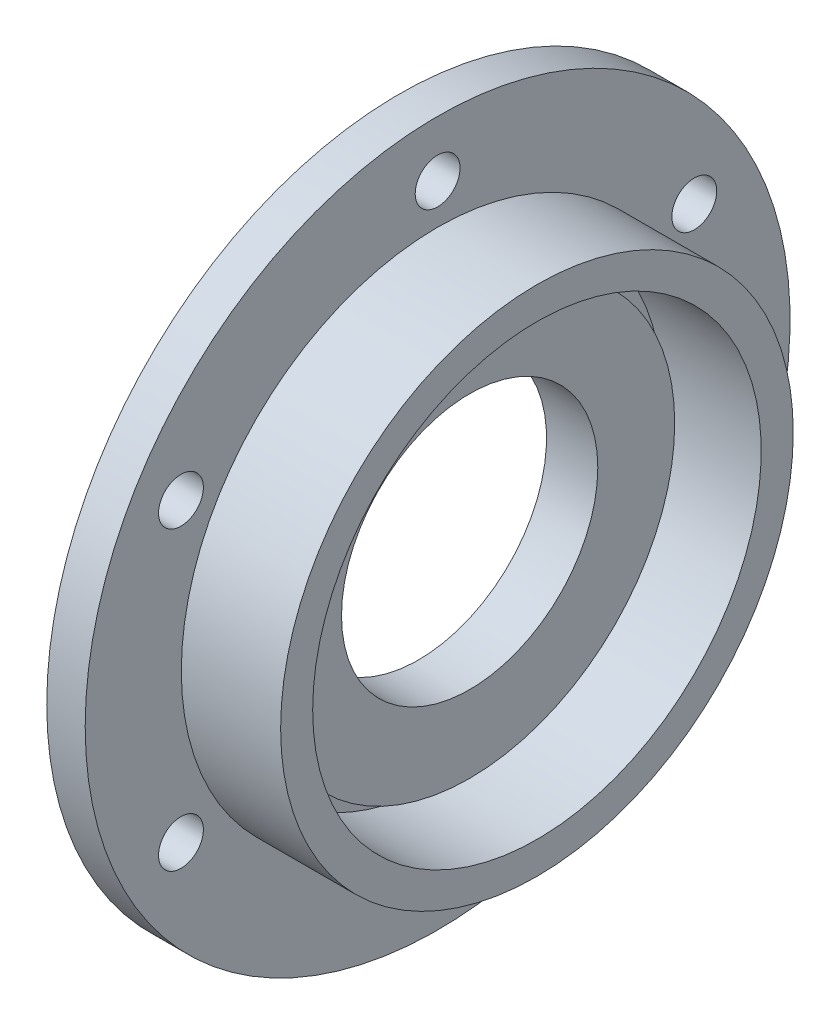
ISO-10303-21;
HEADER;
FILE_DESCRIPTION(('STEP AP214'),'2;1');
FILE_NAME('part.step','',(''),(''),'','','');
FILE_SCHEMA(('AUTOMOTIVE_DESIGN { 1 0 10303 214 1 1 1 1 }'));
ENDSEC;
DATA;
#1=APPLICATION_CONTEXT('core data for automotive mechanical design processes');
#2=APPLICATION_PROTOCOL_DEFINITION('international standard','automotive_design',2000,#1);
#3=PRODUCT_CONTEXT('',#1,'mechanical');
#4=PRODUCT('Part','Part','',(#3));
#5=PRODUCT_RELATED_PRODUCT_CATEGORY('part','',(#4));
#6=PRODUCT_DEFINITION_FORMATION('','',#4);
#7=PRODUCT_DEFINITION_CONTEXT('part definition',#1,'design');
#8=PRODUCT_DEFINITION('design','',#6,#7);
#9=PRODUCT_DEFINITION_SHAPE('','',#8);
#10=(LENGTH_UNIT() NAMED_UNIT(*) SI_UNIT(.MILLI.,.METRE.));
#11=(NAMED_UNIT(*) PLANE_ANGLE_UNIT() SI_UNIT($,.RADIAN.));
#12=(NAMED_UNIT(*) SI_UNIT($,.STERADIAN.) SOLID_ANGLE_UNIT());
#13=UNCERTAINTY_MEASURE_WITH_UNIT(LENGTH_MEASURE(1.E-05),#10,'distance_accuracy_value','');
#14=(GEOMETRIC_REPRESENTATION_CONTEXT(3) GLOBAL_UNCERTAINTY_ASSIGNED_CONTEXT((#13)) GLOBAL_UNIT_ASSIGNED_CONTEXT((#10,
#11,#12)) REPRESENTATION_CONTEXT('',''));
#15=CARTESIAN_POINT('',(0.,0.,0.));
#16=DIRECTION('',(0.,0.,1.));
#17=DIRECTION('',(1.,0.,0.));
#18=AXIS2_PLACEMENT_3D('',#15,#16,#17);
#19=CARTESIAN_POINT('',(12.,70.,0.));
#20=DIRECTION('',(-1.,0.,0.));
#21=DIRECTION('',(0.,0.,1.));
#22=AXIS2_PLACEMENT_3D('',#19,#20,#21);
#23=PLANE('',#22);
#24=CARTESIAN_POINT('',(12.,0.,0.));
#25=DIRECTION('',(-1.,0.,0.));
#26=DIRECTION('',(0.,0.,1.));
#27=AXIS2_PLACEMENT_3D('',#24,#25,#26);
#28=CIRCLE('',#27,70.);
#29=CARTESIAN_POINT('',(12.,0.,70.));
#30=VERTEX_POINT('',#29);
#31=EDGE_CURVE('E64',#30,#30,#28,.T.);
#32=ORIENTED_EDGE('',*,*,#31,.F.);
#33=EDGE_LOOP('',(#32));
#34=FACE_BOUND('',#33,.T.);
#35=CARTESIAN_POINT('',(12.,0.,0.));
#36=DIRECTION('',(-1.,0.,0.));
#37=DIRECTION('',(0.,0.,1.));
#38=AXIS2_PLACEMENT_3D('',#35,#36,#37);
#39=CIRCLE('',#38,64.);
#40=CARTESIAN_POINT('',(12.,0.,64.));
#41=VERTEX_POINT('',#40);
#42=EDGE_CURVE('E10',#41,#41,#39,.F.);
#43=ORIENTED_EDGE('',*,*,#42,.F.);
#44=EDGE_LOOP('',(#43));
#45=FACE_BOUND('',#44,.T.);
#46=ADVANCED_FACE('F35',(#34,#45),#23,.F.);
#47=CARTESIAN_POINT('',(0.,0.,0.));
#48=DIRECTION('',(-1.,0.,0.));
#49=DIRECTION('',(0.,0.,1.));
#50=AXIS2_PLACEMENT_3D('',#47,#48,#49);
#51=CYLINDRICAL_SURFACE('',#50,75.);
#52=CARTESIAN_POINT('',(6.00000000000001,0.,0.));
#53=DIRECTION('',(-1.,0.,0.));
#54=DIRECTION('',(0.,0.,1.));
#55=AXIS2_PLACEMENT_3D('',#52,#53,#54);
#56=CIRCLE('',#55,75.);
#57=CARTESIAN_POINT('',(6.00000000000001,0.,75.));
#58=VERTEX_POINT('',#57);
#59=EDGE_CURVE('E67',#58,#58,#56,.T.);
#60=ORIENTED_EDGE('',*,*,#59,.F.);
#61=EDGE_LOOP('',(#60));
#62=FACE_BOUND('',#61,.T.);
#63=CARTESIAN_POINT('',(0.,0.,0.));
#64=DIRECTION('',(-1.,0.,0.));
#65=DIRECTION('',(0.,0.,1.));
#66=AXIS2_PLACEMENT_3D('',#63,#64,#65);
#67=CIRCLE('',#66,75.);
#68=CARTESIAN_POINT('',(0.,0.,75.));
#69=VERTEX_POINT('',#68);
#70=EDGE_CURVE('E42',#69,#69,#67,.T.);
#71=ORIENTED_EDGE('',*,*,#70,.T.);
#72=EDGE_LOOP('',(#71));
#73=FACE_BOUND('',#72,.T.);
#74=ADVANCED_FACE('F37',(#62,#73),#51,.F.);
#75=CARTESIAN_POINT('',(0.,75.,0.));
#76=DIRECTION('',(1.,0.,0.));
#77=DIRECTION('',(0.,0.,-1.));
#78=AXIS2_PLACEMENT_3D('',#75,#76,#77);
#79=PLANE('',#78);
#80=CARTESIAN_POINT('',(0.,92.5,0.));
#81=DIRECTION('',(-1.,0.,0.));
#82=DIRECTION('',(0.,0.,1.));
#83=AXIS2_PLACEMENT_3D('',#80,#81,#82);
#84=CIRCLE('',#83,7.);
#85=CARTESIAN_POINT('',(0.,92.5,7.));
#86=VERTEX_POINT('',#85);
#87=EDGE_CURVE('E94',#86,#86,#84,.T.);
#88=ORIENTED_EDGE('',*,*,#87,.F.);
#89=EDGE_LOOP('',(#88));
#90=FACE_BOUND('',#89,.T.);
#91=CARTESIAN_POINT('',(0.,46.2500000000009,-80.10734985006));
#92=DIRECTION('',(-1.,0.,0.));
#93=DIRECTION('',(0.,0.,1.));
#94=AXIS2_PLACEMENT_3D('',#91,#92,#93);
#95=CIRCLE('',#94,7.);
#96=CARTESIAN_POINT('',(0.,46.2500000000009,-73.10734985006));
#97=VERTEX_POINT('',#96);
#98=EDGE_CURVE('E78',#97,#97,#95,.T.);
#99=ORIENTED_EDGE('',*,*,#98,.F.);
#100=EDGE_LOOP('',(#99));
#101=FACE_BOUND('',#100,.T.);
#102=CARTESIAN_POINT('',(0.,-46.2499999999992,-80.107349850061));
#103=DIRECTION('',(-1.,0.,0.));
#104=DIRECTION('',(0.,0.,1.));
#105=AXIS2_PLACEMENT_3D('',#102,#103,#104);
#106=CIRCLE('',#105,7.);
#107=CARTESIAN_POINT('',(0.,-46.2499999999992,-73.107349850061));
#108=VERTEX_POINT('',#107);
#109=EDGE_CURVE('E71',#108,#108,#106,.T.);
#110=ORIENTED_EDGE('',*,*,#109,.F.);
#111=EDGE_LOOP('',(#110));
#112=FACE_BOUND('',#111,.T.);
#113=CARTESIAN_POINT('',(0.,-92.5,-6.4592404768598E-13));
#114=DIRECTION('',(-1.,0.,0.));
#115=DIRECTION('',(0.,0.,1.));
#116=AXIS2_PLACEMENT_3D('',#113,#114,#115);
#117=CIRCLE('',#116,7.);
#118=CARTESIAN_POINT('',(0.,-92.5,6.99999999999936));
#119=VERTEX_POINT('',#118);
#120=EDGE_CURVE('E79',#119,#119,#117,.T.);
#121=ORIENTED_EDGE('',*,*,#120,.F.);
#122=EDGE_LOOP('',(#121));
#123=FACE_BOUND('',#122,.T.);
#124=CARTESIAN_POINT('',(0.,-46.2500000000004,80.1073498500604));
#125=DIRECTION('',(-1.,0.,0.));
#126=DIRECTION('',(0.,0.,1.));
#127=AXIS2_PLACEMENT_3D('',#124,#125,#126);
#128=CIRCLE('',#127,7.);
#129=CARTESIAN_POINT('',(0.,-46.2500000000004,87.1073498500604));
#130=VERTEX_POINT('',#129);
#131=EDGE_CURVE('E85',#130,#130,#128,.T.);
#132=ORIENTED_EDGE('',*,*,#131,.F.);
#133=EDGE_LOOP('',(#132));
#134=FACE_BOUND('',#133,.T.);
#135=CARTESIAN_POINT('',(0.,46.2499999999998,80.1073498500607));
#136=DIRECTION('',(-1.,0.,0.));
#137=DIRECTION('',(0.,0.,1.));
#138=AXIS2_PLACEMENT_3D('',#135,#136,#137);
#139=CIRCLE('',#138,7.00000000000001);
#140=CARTESIAN_POINT('',(0.,46.2499999999998,87.1073498500607));
#141=VERTEX_POINT('',#140);
#142=EDGE_CURVE('E91',#141,#141,#139,.T.);
#143=ORIENTED_EDGE('',*,*,#142,.F.);
#144=EDGE_LOOP('',(#143));
#145=FACE_BOUND('',#144,.T.);
#146=ORIENTED_EDGE('',*,*,#70,.F.);
#147=EDGE_LOOP('',(#146));
#148=FACE_BOUND('',#147,.T.);
#149=CARTESIAN_POINT('',(0.,0.,0.));
#150=DIRECTION('',(-1.,0.,0.));
#151=DIRECTION('',(0.,0.,1.));
#152=AXIS2_PLACEMENT_3D('',#149,#150,#151);
#153=CIRCLE('',#152,110.);
#154=CARTESIAN_POINT('',(0.,0.,110.));
#155=VERTEX_POINT('',#154);
#156=EDGE_CURVE('E46',#155,#155,#153,.T.);
#157=ORIENTED_EDGE('',*,*,#156,.T.);
#158=EDGE_LOOP('',(#157));
#159=FACE_BOUND('',#158,.T.);
#160=ADVANCED_FACE('F138',(#90,#101,#112,#123,#134,#145,#148,#159),#79,.F.);
#161=CARTESIAN_POINT('',(0.,0.,0.));
#162=DIRECTION('',(-1.,0.,0.));
#163=DIRECTION('',(0.,0.,1.));
#164=AXIS2_PLACEMENT_3D('',#161,#162,#163);
#165=CYLINDRICAL_SURFACE('',#164,110.);
#166=ORIENTED_EDGE('',*,*,#156,.F.);
#167=EDGE_LOOP('',(#166));
#168=FACE_BOUND('',#167,.T.);
#169=CARTESIAN_POINT('',(12.,0.,0.));
#170=DIRECTION('',(-1.,0.,0.));
#171=DIRECTION('',(0.,0.,1.));
#172=AXIS2_PLACEMENT_3D('',#169,#170,#171);
#173=CIRCLE('',#172,110.);
#174=CARTESIAN_POINT('',(12.,0.,110.));
#175=VERTEX_POINT('',#174);
#176=EDGE_CURVE('E50',#175,#175,#173,.T.);
#177=ORIENTED_EDGE('',*,*,#176,.T.);
#178=EDGE_LOOP('',(#177));
#179=FACE_BOUND('',#178,.T.);
#180=ADVANCED_FACE('F161',(#168,#179),#165,.T.);
#181=CARTESIAN_POINT('',(12.,110.,0.));
#182=DIRECTION('',(-1.,0.,0.));
#183=DIRECTION('',(0.,0.,1.));
#184=AXIS2_PLACEMENT_3D('',#181,#182,#183);
#185=PLANE('',#184);
#186=CARTESIAN_POINT('',(12.,92.5,0.));
#187=DIRECTION('',(-1.,0.,0.));
#188=DIRECTION('',(0.,0.,1.));
#189=AXIS2_PLACEMENT_3D('',#186,#187,#188);
#190=CIRCLE('',#189,7.);
#191=CARTESIAN_POINT('',(12.,92.5,7.));
#192=VERTEX_POINT('',#191);
#193=EDGE_CURVE('E70',#192,#192,#190,.F.);
#194=ORIENTED_EDGE('',*,*,#193,.F.);
#195=EDGE_LOOP('',(#194));
#196=FACE_BOUND('',#195,.T.);
#197=CARTESIAN_POINT('',(12.,46.2500000000009,-80.10734985006));
#198=DIRECTION('',(-1.,0.,0.));
#199=DIRECTION('',(0.,0.,1.));
#200=AXIS2_PLACEMENT_3D('',#197,#198,#199);
#201=CIRCLE('',#200,7.);
#202=CARTESIAN_POINT('',(12.,46.2500000000009,-73.10734985006));
#203=VERTEX_POINT('',#202);
#204=EDGE_CURVE('E99',#203,#203,#201,.F.);
#205=ORIENTED_EDGE('',*,*,#204,.F.);
#206=EDGE_LOOP('',(#205));
#207=FACE_BOUND('',#206,.T.);
#208=CARTESIAN_POINT('',(12.,-46.2499999999992,-80.107349850061));
#209=DIRECTION('',(-1.,0.,0.));
#210=DIRECTION('',(0.,0.,1.));
#211=AXIS2_PLACEMENT_3D('',#208,#209,#210);
#212=CIRCLE('',#211,7.);
#213=CARTESIAN_POINT('',(12.,-46.2499999999992,-73.107349850061));
#214=VERTEX_POINT('',#213);
#215=EDGE_CURVE('E75',#214,#214,#212,.F.);
#216=ORIENTED_EDGE('',*,*,#215,.F.);
#217=EDGE_LOOP('',(#216));
#218=FACE_BOUND('',#217,.T.);
#219=CARTESIAN_POINT('',(12.,-92.5,-6.4592404768598E-13));
#220=DIRECTION('',(-1.,0.,0.));
#221=DIRECTION('',(0.,0.,1.));
#222=AXIS2_PLACEMENT_3D('',#219,#220,#221);
#223=CIRCLE('',#222,7.);
#224=CARTESIAN_POINT('',(12.,-92.5,6.99999999999936));
#225=VERTEX_POINT('',#224);
#226=EDGE_CURVE('E74',#225,#225,#223,.F.);
#227=ORIENTED_EDGE('',*,*,#226,.F.);
#228=EDGE_LOOP('',(#227));
#229=FACE_BOUND('',#228,.T.);
#230=CARTESIAN_POINT('',(12.,-46.2500000000004,80.1073498500604));
#231=DIRECTION('',(-1.,0.,0.));
#232=DIRECTION('',(0.,0.,1.));
#233=AXIS2_PLACEMENT_3D('',#230,#231,#232);
#234=CIRCLE('',#233,7.);
#235=CARTESIAN_POINT('',(12.,-46.2500000000004,87.1073498500604));
#236=VERTEX_POINT('',#235);
#237=EDGE_CURVE('E82',#236,#236,#234,.F.);
#238=ORIENTED_EDGE('',*,*,#237,.F.);
#239=EDGE_LOOP('',(#238));
#240=FACE_BOUND('',#239,.T.);
#241=CARTESIAN_POINT('',(12.,46.2499999999998,80.1073498500607));
#242=DIRECTION('',(-1.,0.,0.));
#243=DIRECTION('',(0.,0.,1.));
#244=AXIS2_PLACEMENT_3D('',#241,#242,#243);
#245=CIRCLE('',#244,7.00000000000001);
#246=CARTESIAN_POINT('',(12.,46.2499999999998,87.1073498500607));
#247=VERTEX_POINT('',#246);
#248=EDGE_CURVE('E88',#247,#247,#245,.F.);
#249=ORIENTED_EDGE('',*,*,#248,.F.);
#250=EDGE_LOOP('',(#249));
#251=FACE_BOUND('',#250,.T.);
#252=ORIENTED_EDGE('',*,*,#176,.F.);
#253=EDGE_LOOP('',(#252));
#254=FACE_BOUND('',#253,.T.);
#255=CARTESIAN_POINT('',(12.,0.,0.));
#256=DIRECTION('',(-1.,0.,0.));
#257=DIRECTION('',(0.,0.,1.));
#258=AXIS2_PLACEMENT_3D('',#255,#256,#257);
#259=CIRCLE('',#258,80.);
#260=CARTESIAN_POINT('',(12.,0.,80.));
#261=VERTEX_POINT('',#260);
#262=EDGE_CURVE('E55',#261,#261,#259,.T.);
#263=ORIENTED_EDGE('',*,*,#262,.T.);
#264=EDGE_LOOP('',(#263));
#265=FACE_BOUND('',#264,.T.);
#266=ADVANCED_FACE('F157',(#196,#207,#218,#229,#240,#251,#254,#265),#185,.F.);
#267=CARTESIAN_POINT('',(0.,0.,0.));
#268=DIRECTION('',(-1.,0.,0.));
#269=DIRECTION('',(0.,0.,1.));
#270=AXIS2_PLACEMENT_3D('',#267,#268,#269);
#271=CYLINDRICAL_SURFACE('',#270,80.);
#272=ORIENTED_EDGE('',*,*,#262,.F.);
#273=EDGE_LOOP('',(#272));
#274=FACE_BOUND('',#273,.T.);
#275=CARTESIAN_POINT('',(43.,0.,0.));
#276=DIRECTION('',(-1.,0.,0.));
#277=DIRECTION('',(0.,0.,1.));
#278=AXIS2_PLACEMENT_3D('',#275,#276,#277);
#279=CIRCLE('',#278,80.);
#280=CARTESIAN_POINT('',(43.,0.,80.));
#281=VERTEX_POINT('',#280);
#282=EDGE_CURVE('E58',#281,#281,#279,.T.);
#283=ORIENTED_EDGE('',*,*,#282,.T.);
#284=EDGE_LOOP('',(#283));
#285=FACE_BOUND('',#284,.T.);
#286=ADVANCED_FACE('F153',(#274,#285),#271,.T.);
#287=CARTESIAN_POINT('',(43.,80.,0.));
#288=DIRECTION('',(-1.,0.,0.));
#289=DIRECTION('',(0.,0.,1.));
#290=AXIS2_PLACEMENT_3D('',#287,#288,#289);
#291=PLANE('',#290);
#292=ORIENTED_EDGE('',*,*,#282,.F.);
#293=EDGE_LOOP('',(#292));
#294=FACE_BOUND('',#293,.T.);
#295=CARTESIAN_POINT('',(43.,0.,0.));
#296=DIRECTION('',(-1.,0.,0.));
#297=DIRECTION('',(0.,0.,1.));
#298=AXIS2_PLACEMENT_3D('',#295,#296,#297);
#299=CIRCLE('',#298,70.);
#300=CARTESIAN_POINT('',(43.,0.,70.));
#301=VERTEX_POINT('',#300);
#302=EDGE_CURVE('E61',#301,#301,#299,.T.);
#303=ORIENTED_EDGE('',*,*,#302,.T.);
#304=EDGE_LOOP('',(#303));
#305=FACE_BOUND('',#304,.T.);
#306=ADVANCED_FACE('F149',(#294,#305),#291,.F.);
#307=CARTESIAN_POINT('',(0.,0.,0.));
#308=DIRECTION('',(-1.,0.,0.));
#309=DIRECTION('',(0.,0.,1.));
#310=AXIS2_PLACEMENT_3D('',#307,#308,#309);
#311=CYLINDRICAL_SURFACE('',#310,70.);
#312=ORIENTED_EDGE('',*,*,#302,.F.);
#313=EDGE_LOOP('',(#312));
#314=FACE_BOUND('',#313,.T.);
#315=ORIENTED_EDGE('',*,*,#31,.T.);
#316=EDGE_LOOP('',(#315));
#317=FACE_BOUND('',#316,.T.);
#318=ADVANCED_FACE('F146',(#314,#317),#311,.F.);
#319=CARTESIAN_POINT('',(6.00000000000001,0.,0.));
#320=DIRECTION('',(1.,0.,0.));
#321=DIRECTION('',(0.,0.,-1.));
#322=AXIS2_PLACEMENT_3D('',#319,#320,#321);
#323=PLANE('',#322);
#324=CARTESIAN_POINT('',(6.00000000000001,0.,0.));
#325=DIRECTION('',(-1.,0.,0.));
#326=DIRECTION('',(0.,0.,1.));
#327=AXIS2_PLACEMENT_3D('',#324,#325,#326);
#328=CIRCLE('',#327,40.);
#329=CARTESIAN_POINT('',(6.00000000000001,0.,40.));
#330=VERTEX_POINT('',#329);
#331=EDGE_CURVE('E102',#330,#330,#328,.T.);
#332=ORIENTED_EDGE('',*,*,#331,.F.);
#333=EDGE_LOOP('',(#332));
#334=FACE_BOUND('',#333,.T.);
#335=ORIENTED_EDGE('',*,*,#59,.T.);
#336=EDGE_LOOP('',(#335));
#337=FACE_BOUND('',#336,.T.);
#338=ADVANCED_FACE('F144',(#334,#337),#323,.F.);
#339=CARTESIAN_POINT('',(31.7989898732233,46.2499999999998,80.1073498500607));
#340=DIRECTION('',(-1.,0.,0.));
#341=DIRECTION('',(0.,0.,1.));
#342=AXIS2_PLACEMENT_3D('',#339,#340,#341);
#343=CYLINDRICAL_SURFACE('',#342,7.00000000000001);
#344=ORIENTED_EDGE('',*,*,#248,.T.);
#345=EDGE_LOOP('',(#344));
#346=FACE_BOUND('',#345,.T.);
#347=ORIENTED_EDGE('',*,*,#142,.T.);
#348=EDGE_LOOP('',(#347));
#349=FACE_BOUND('',#348,.T.);
#350=ADVANCED_FACE('F194',(#346,#349),#343,.F.);
#351=CARTESIAN_POINT('',(31.7989898732233,-46.2500000000004,80.1073498500604));
#352=DIRECTION('',(-1.,0.,0.));
#353=DIRECTION('',(0.,0.,1.));
#354=AXIS2_PLACEMENT_3D('',#351,#352,#353);
#355=CYLINDRICAL_SURFACE('',#354,7.);
#356=ORIENTED_EDGE('',*,*,#237,.T.);
#357=EDGE_LOOP('',(#356));
#358=FACE_BOUND('',#357,.T.);
#359=ORIENTED_EDGE('',*,*,#131,.T.);
#360=EDGE_LOOP('',(#359));
#361=FACE_BOUND('',#360,.T.);
#362=ADVANCED_FACE('F196',(#358,#361),#355,.F.);
#363=CARTESIAN_POINT('',(31.7989898732233,-92.5,-6.4592404768598E-13));
#364=DIRECTION('',(-1.,0.,0.));
#365=DIRECTION('',(0.,0.,1.));
#366=AXIS2_PLACEMENT_3D('',#363,#364,#365);
#367=CYLINDRICAL_SURFACE('',#366,7.);
#368=ORIENTED_EDGE('',*,*,#226,.T.);
#369=EDGE_LOOP('',(#368));
#370=FACE_BOUND('',#369,.T.);
#371=ORIENTED_EDGE('',*,*,#120,.T.);
#372=EDGE_LOOP('',(#371));
#373=FACE_BOUND('',#372,.T.);
#374=ADVANCED_FACE('F203',(#370,#373),#367,.F.);
#375=CARTESIAN_POINT('',(31.7989898732233,-46.2499999999992,-80.107349850061));
#376=DIRECTION('',(-1.,0.,0.));
#377=DIRECTION('',(0.,0.,1.));
#378=AXIS2_PLACEMENT_3D('',#375,#376,#377);
#379=CYLINDRICAL_SURFACE('',#378,7.);
#380=ORIENTED_EDGE('',*,*,#215,.T.);
#381=EDGE_LOOP('',(#380));
#382=FACE_BOUND('',#381,.T.);
#383=ORIENTED_EDGE('',*,*,#109,.T.);
#384=EDGE_LOOP('',(#383));
#385=FACE_BOUND('',#384,.T.);
#386=ADVANCED_FACE('F212',(#382,#385),#379,.F.);
#387=CARTESIAN_POINT('',(31.7989898732233,46.2500000000009,-80.10734985006));
#388=DIRECTION('',(-1.,0.,0.));
#389=DIRECTION('',(0.,0.,1.));
#390=AXIS2_PLACEMENT_3D('',#387,#388,#389);
#391=CYLINDRICAL_SURFACE('',#390,7.);
#392=ORIENTED_EDGE('',*,*,#204,.T.);
#393=EDGE_LOOP('',(#392));
#394=FACE_BOUND('',#393,.T.);
#395=ORIENTED_EDGE('',*,*,#98,.T.);
#396=EDGE_LOOP('',(#395));
#397=FACE_BOUND('',#396,.T.);
#398=ADVANCED_FACE('F208',(#394,#397),#391,.F.);
#399=CARTESIAN_POINT('',(31.7989898732233,92.5,0.));
#400=DIRECTION('',(-1.,0.,0.));
#401=DIRECTION('',(0.,0.,1.));
#402=AXIS2_PLACEMENT_3D('',#399,#400,#401);
#403=CYLINDRICAL_SURFACE('',#402,7.);
#404=ORIENTED_EDGE('',*,*,#193,.T.);
#405=EDGE_LOOP('',(#404));
#406=FACE_BOUND('',#405,.T.);
#407=ORIENTED_EDGE('',*,*,#87,.T.);
#408=EDGE_LOOP('',(#407));
#409=FACE_BOUND('',#408,.T.);
#410=ADVANCED_FACE('F129',(#406,#409),#403,.F.);
#411=CARTESIAN_POINT('',(125.137084989848,0.,0.));
#412=DIRECTION('',(-1.,0.,0.));
#413=DIRECTION('',(0.,0.,1.));
#414=AXIS2_PLACEMENT_3D('',#411,#412,#413);
#415=CYLINDRICAL_SURFACE('',#414,40.);
#416=ORIENTED_EDGE('',*,*,#331,.T.);
#417=EDGE_LOOP('',(#416));
#418=FACE_BOUND('',#417,.T.);
#419=CARTESIAN_POINT('',(22.,0.,0.));
#420=DIRECTION('',(1.,0.,0.));
#421=DIRECTION('',(0.,0.,-1.));
#422=AXIS2_PLACEMENT_3D('',#419,#420,#421);
#423=CIRCLE('',#422,40.);
#424=CARTESIAN_POINT('',(22.,0.,-40.));
#425=VERTEX_POINT('',#424);
#426=EDGE_CURVE('E112',#425,#425,#423,.T.);
#427=ORIENTED_EDGE('',*,*,#426,.T.);
#428=EDGE_LOOP('',(#427));
#429=FACE_BOUND('',#428,.T.);
#430=ADVANCED_FACE('F116',(#418,#429),#415,.F.);
#431=CARTESIAN_POINT('',(22.,0.,0.));
#432=DIRECTION('',(1.,0.,0.));
#433=DIRECTION('',(0.,0.,-1.));
#434=AXIS2_PLACEMENT_3D('',#431,#432,#433);
#435=PLANE('',#434);
#436=CARTESIAN_POINT('',(22.,0.,0.));
#437=DIRECTION('',(1.,0.,0.));
#438=DIRECTION('',(0.,0.,-1.));
#439=AXIS2_PLACEMENT_3D('',#436,#437,#438);
#440=CIRCLE('',#439,64.);
#441=CARTESIAN_POINT('',(22.,0.,-64.));
#442=VERTEX_POINT('',#441);
#443=EDGE_CURVE('E109',#442,#442,#440,.T.);
#444=ORIENTED_EDGE('',*,*,#443,.T.);
#445=EDGE_LOOP('',(#444));
#446=FACE_BOUND('',#445,.T.);
#447=ORIENTED_EDGE('',*,*,#426,.F.);
#448=EDGE_LOOP('',(#447));
#449=FACE_BOUND('',#448,.T.);
#450=ADVANCED_FACE('F118',(#446,#449),#435,.T.);
#451=CARTESIAN_POINT('',(22.,0.,0.));
#452=DIRECTION('',(-1.,0.,0.));
#453=DIRECTION('',(0.,0.,1.));
#454=AXIS2_PLACEMENT_3D('',#451,#452,#453);
#455=CYLINDRICAL_SURFACE('',#454,64.);
#456=ORIENTED_EDGE('',*,*,#443,.F.);
#457=EDGE_LOOP('',(#456));
#458=FACE_BOUND('',#457,.T.);
#459=ORIENTED_EDGE('',*,*,#42,.T.);
#460=EDGE_LOOP('',(#459));
#461=FACE_BOUND('',#460,.T.);
#462=ADVANCED_FACE('F120',(#458,#461),#455,.T.);
#463=CLOSED_SHELL('',(#46,#74,#160,#180,#266,#286,#306,#318,#338,#350,#362,#374,#386,#398,#410,
#430,#450,#462));
#464=MANIFOLD_SOLID_BREP('B2',#463);
#465=ADVANCED_BREP_SHAPE_REPRESENTATION('',(#18,#464),#14);
#466=SHAPE_DEFINITION_REPRESENTATION(#9,#465);
ENDSEC;
END-ISO-10303-21;
